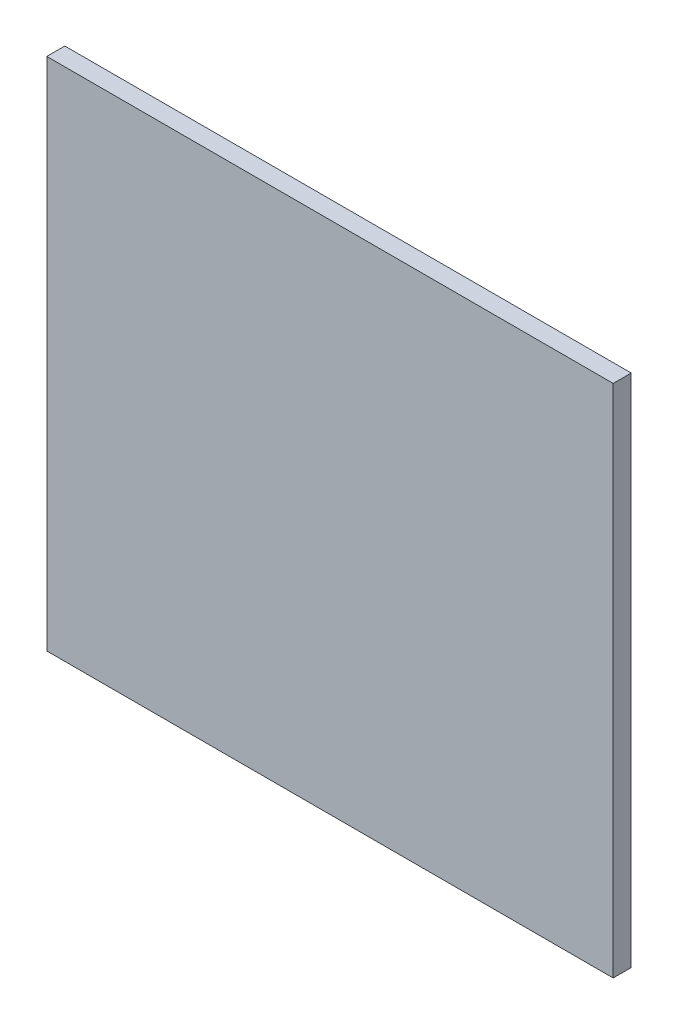
ISO-10303-21;
HEADER;
FILE_DESCRIPTION(('STEP AP214'),'2;1');
FILE_NAME('part.step','',(''),(''),'','','');
FILE_SCHEMA(('AUTOMOTIVE_DESIGN { 1 0 10303 214 1 1 1 1 }'));
ENDSEC;
DATA;
#1=APPLICATION_CONTEXT('core data for automotive mechanical design processes');
#2=APPLICATION_PROTOCOL_DEFINITION('international standard','automotive_design',2000,#1);
#3=PRODUCT_CONTEXT('',#1,'mechanical');
#4=PRODUCT('Part','Part','',(#3));
#5=PRODUCT_RELATED_PRODUCT_CATEGORY('part','',(#4));
#6=PRODUCT_DEFINITION_FORMATION('','',#4);
#7=PRODUCT_DEFINITION_CONTEXT('part definition',#1,'design');
#8=PRODUCT_DEFINITION('design','',#6,#7);
#9=PRODUCT_DEFINITION_SHAPE('','',#8);
#10=(LENGTH_UNIT() NAMED_UNIT(*) SI_UNIT(.MILLI.,.METRE.));
#11=(NAMED_UNIT(*) PLANE_ANGLE_UNIT() SI_UNIT($,.RADIAN.));
#12=(NAMED_UNIT(*) SI_UNIT($,.STERADIAN.) SOLID_ANGLE_UNIT());
#13=UNCERTAINTY_MEASURE_WITH_UNIT(LENGTH_MEASURE(1.E-05),#10,'distance_accuracy_value','');
#14=(GEOMETRIC_REPRESENTATION_CONTEXT(3) GLOBAL_UNCERTAINTY_ASSIGNED_CONTEXT((#13)) GLOBAL_UNIT_ASSIGNED_CONTEXT((#10,
#11,#12)) REPRESENTATION_CONTEXT('',''));
#15=CARTESIAN_POINT('',(0.,0.,0.));
#16=DIRECTION('',(0.,0.,1.));
#17=DIRECTION('',(1.,0.,0.));
#18=AXIS2_PLACEMENT_3D('',#15,#16,#17);
#19=CARTESIAN_POINT('',(117.204,-118.033,1.635));
#20=DIRECTION('',(0.,0.,-1.));
#21=DIRECTION('',(0.,-1.,0.));
#22=AXIS2_PLACEMENT_3D('',#19,#20,#21);
#23=PLANE('',#22);
#24=DIRECTION('',(0.,-1.,0.));
#25=VECTOR('',#24,1.);
#26=CARTESIAN_POINT('',(117.754,-117.533,1.635));
#27=LINE('',#26,#25);
#28=CARTESIAN_POINT('',(117.754,-117.533,1.635));
#29=VERTEX_POINT('',#28);
#30=CARTESIAN_POINT('',(117.754,-118.533,1.635));
#31=VERTEX_POINT('',#30);
#32=EDGE_CURVE('E20',#29,#31,#27,.T.);
#33=ORIENTED_EDGE('',*,*,#32,.F.);
#34=DIRECTION('',(1.,0.,0.));
#35=VECTOR('',#34,1.);
#36=CARTESIAN_POINT('',(116.654,-117.533,1.635));
#37=LINE('',#36,#35);
#38=CARTESIAN_POINT('',(116.654,-117.533,1.635));
#39=VERTEX_POINT('',#38);
#40=EDGE_CURVE('E98',#39,#29,#37,.T.);
#41=ORIENTED_EDGE('',*,*,#40,.F.);
#42=DIRECTION('',(0.,1.,0.));
#43=VECTOR('',#42,1.);
#44=CARTESIAN_POINT('',(116.654,-118.533,1.635));
#45=LINE('',#44,#43);
#46=CARTESIAN_POINT('',(116.654,-118.533,1.635));
#47=VERTEX_POINT('',#46);
#48=EDGE_CURVE('E84',#47,#39,#45,.T.);
#49=ORIENTED_EDGE('',*,*,#48,.F.);
#50=DIRECTION('',(-1.,0.,0.));
#51=VECTOR('',#50,1.);
#52=CARTESIAN_POINT('',(117.754,-118.533,1.635));
#53=LINE('',#52,#51);
#54=EDGE_CURVE('E88',#31,#47,#53,.T.);
#55=ORIENTED_EDGE('',*,*,#54,.F.);
#56=EDGE_LOOP('',(#33,#41,#49,#55));
#57=FACE_BOUND('',#56,.T.);
#58=ADVANCED_FACE('F17',(#57),#23,.F.);
#59=CARTESIAN_POINT('',(117.204,-118.033,1.6));
#60=DIRECTION('',(0.,0.,-1.));
#61=DIRECTION('',(0.,-1.,0.));
#62=AXIS2_PLACEMENT_3D('',#59,#60,#61);
#63=PLANE('',#62);
#64=DIRECTION('',(-1.,0.,0.));
#65=VECTOR('',#64,1.);
#66=CARTESIAN_POINT('',(117.754,-118.533,1.6));
#67=LINE('',#66,#65);
#68=CARTESIAN_POINT('',(117.754,-118.533,1.6));
#69=VERTEX_POINT('',#68);
#70=CARTESIAN_POINT('',(116.654,-118.533,1.6));
#71=VERTEX_POINT('',#70);
#72=EDGE_CURVE('E72',#69,#71,#67,.T.);
#73=ORIENTED_EDGE('',*,*,#72,.T.);
#74=DIRECTION('',(0.,1.,0.));
#75=VECTOR('',#74,1.);
#76=CARTESIAN_POINT('',(116.654,-118.533,1.6));
#77=LINE('',#76,#75);
#78=CARTESIAN_POINT('',(116.654,-117.533,1.6));
#79=VERTEX_POINT('',#78);
#80=EDGE_CURVE('E103',#71,#79,#77,.T.);
#81=ORIENTED_EDGE('',*,*,#80,.T.);
#82=DIRECTION('',(1.,0.,0.));
#83=VECTOR('',#82,1.);
#84=CARTESIAN_POINT('',(116.654,-117.533,1.6));
#85=LINE('',#84,#83);
#86=CARTESIAN_POINT('',(117.754,-117.533,1.6));
#87=VERTEX_POINT('',#86);
#88=EDGE_CURVE('E74',#79,#87,#85,.T.);
#89=ORIENTED_EDGE('',*,*,#88,.T.);
#90=DIRECTION('',(0.,-1.,0.));
#91=VECTOR('',#90,1.);
#92=CARTESIAN_POINT('',(117.754,-117.533,1.6));
#93=LINE('',#92,#91);
#94=EDGE_CURVE('E11',#87,#69,#93,.T.);
#95=ORIENTED_EDGE('',*,*,#94,.T.);
#96=EDGE_LOOP('',(#73,#81,#89,#95));
#97=FACE_BOUND('',#96,.T.);
#98=ADVANCED_FACE('F70',(#97),#63,.T.);
#99=CARTESIAN_POINT('',(117.754,-117.533,1.6));
#100=DIRECTION('',(1.,0.,0.));
#101=DIRECTION('',(0.,1.,0.));
#102=AXIS2_PLACEMENT_3D('',#99,#100,#101);
#103=PLANE('',#102);
#104=DIRECTION('',(0.,0.,1.));
#105=VECTOR('',#104,1.);
#106=CARTESIAN_POINT('',(117.754,-117.533,1.6));
#107=LINE('',#106,#105);
#108=EDGE_CURVE('E102',#87,#29,#107,.T.);
#109=ORIENTED_EDGE('',*,*,#108,.T.);
#110=ORIENTED_EDGE('',*,*,#32,.T.);
#111=DIRECTION('',(0.,0.,1.));
#112=VECTOR('',#111,1.);
#113=CARTESIAN_POINT('',(117.754,-118.533,1.6));
#114=LINE('',#113,#112);
#115=EDGE_CURVE('E80',#69,#31,#114,.T.);
#116=ORIENTED_EDGE('',*,*,#115,.F.);
#117=ORIENTED_EDGE('',*,*,#94,.F.);
#118=EDGE_LOOP('',(#109,#110,#116,#117));
#119=FACE_BOUND('',#118,.T.);
#120=ADVANCED_FACE('F86',(#119),#103,.T.);
#121=CARTESIAN_POINT('',(116.654,-117.533,1.6));
#122=DIRECTION('',(0.,1.,0.));
#123=DIRECTION('',(1.,0.,0.));
#124=AXIS2_PLACEMENT_3D('',#121,#122,#123);
#125=PLANE('',#124);
#126=DIRECTION('',(0.,0.,1.));
#127=VECTOR('',#126,1.);
#128=CARTESIAN_POINT('',(116.654,-117.533,1.6));
#129=LINE('',#128,#127);
#130=EDGE_CURVE('E107',#79,#39,#129,.T.);
#131=ORIENTED_EDGE('',*,*,#130,.T.);
#132=ORIENTED_EDGE('',*,*,#40,.T.);
#133=ORIENTED_EDGE('',*,*,#108,.F.);
#134=ORIENTED_EDGE('',*,*,#88,.F.);
#135=EDGE_LOOP('',(#131,#132,#133,#134));
#136=FACE_BOUND('',#135,.T.);
#137=ADVANCED_FACE('F144',(#136),#125,.T.);
#138=CARTESIAN_POINT('',(116.654,-118.533,1.6));
#139=DIRECTION('',(-1.,0.,0.));
#140=DIRECTION('',(0.,0.,1.));
#141=AXIS2_PLACEMENT_3D('',#138,#139,#140);
#142=PLANE('',#141);
#143=DIRECTION('',(0.,0.,1.));
#144=VECTOR('',#143,1.);
#145=CARTESIAN_POINT('',(116.654,-118.533,1.6));
#146=LINE('',#145,#144);
#147=EDGE_CURVE('E82',#71,#47,#146,.T.);
#148=ORIENTED_EDGE('',*,*,#147,.T.);
#149=ORIENTED_EDGE('',*,*,#48,.T.);
#150=ORIENTED_EDGE('',*,*,#130,.F.);
#151=ORIENTED_EDGE('',*,*,#80,.F.);
#152=EDGE_LOOP('',(#148,#149,#150,#151));
#153=FACE_BOUND('',#152,.T.);
#154=ADVANCED_FACE('F133',(#153),#142,.T.);
#155=CARTESIAN_POINT('',(117.754,-118.533,1.6));
#156=DIRECTION('',(0.,-1.,0.));
#157=DIRECTION('',(0.,0.,-1.));
#158=AXIS2_PLACEMENT_3D('',#155,#156,#157);
#159=PLANE('',#158);
#160=ORIENTED_EDGE('',*,*,#115,.T.);
#161=ORIENTED_EDGE('',*,*,#54,.T.);
#162=ORIENTED_EDGE('',*,*,#147,.F.);
#163=ORIENTED_EDGE('',*,*,#72,.F.);
#164=EDGE_LOOP('',(#160,#161,#162,#163));
#165=FACE_BOUND('',#164,.T.);
#166=ADVANCED_FACE('F78',(#165),#159,.T.);
#167=CLOSED_SHELL('',(#58,#98,#120,#137,#154,#166));
#168=MANIFOLD_SOLID_BREP('B1',#167);
#169=ADVANCED_BREP_SHAPE_REPRESENTATION('',(#18,#168),#14);
#170=SHAPE_DEFINITION_REPRESENTATION(#9,#169);
ENDSEC;
END-ISO-10303-21;
